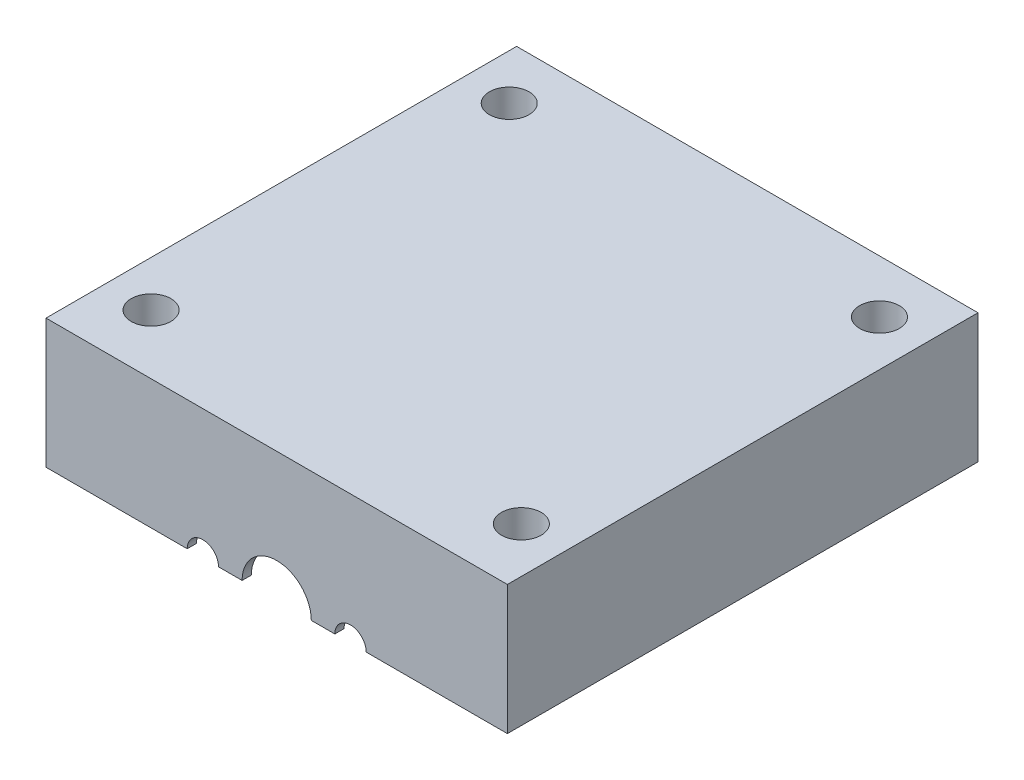
ISO-10303-21;
HEADER;
FILE_DESCRIPTION(('STEP AP214'),'2;1');
FILE_NAME('part.step','',(''),(''),'','','');
FILE_SCHEMA(('AUTOMOTIVE_DESIGN { 1 0 10303 214 1 1 1 1 }'));
ENDSEC;
DATA;
#1=APPLICATION_CONTEXT('core data for automotive mechanical design processes');
#2=APPLICATION_PROTOCOL_DEFINITION('international standard','automotive_design',2000,#1);
#3=PRODUCT_CONTEXT('',#1,'mechanical');
#4=PRODUCT('Part','Part','',(#3));
#5=PRODUCT_RELATED_PRODUCT_CATEGORY('part','',(#4));
#6=PRODUCT_DEFINITION_FORMATION('','',#4);
#7=PRODUCT_DEFINITION_CONTEXT('part definition',#1,'design');
#8=PRODUCT_DEFINITION('design','',#6,#7);
#9=PRODUCT_DEFINITION_SHAPE('','',#8);
#10=(LENGTH_UNIT() NAMED_UNIT(*) SI_UNIT(.MILLI.,.METRE.));
#11=(NAMED_UNIT(*) PLANE_ANGLE_UNIT() SI_UNIT($,.RADIAN.));
#12=(NAMED_UNIT(*) SI_UNIT($,.STERADIAN.) SOLID_ANGLE_UNIT());
#13=UNCERTAINTY_MEASURE_WITH_UNIT(LENGTH_MEASURE(1.E-05),#10,'distance_accuracy_value','');
#14=(GEOMETRIC_REPRESENTATION_CONTEXT(3) GLOBAL_UNCERTAINTY_ASSIGNED_CONTEXT((#13)) GLOBAL_UNIT_ASSIGNED_CONTEXT((#10,
#11,#12)) REPRESENTATION_CONTEXT('',''));
#15=CARTESIAN_POINT('',(0.,0.,0.));
#16=DIRECTION('',(0.,0.,1.));
#17=DIRECTION('',(1.,0.,0.));
#18=AXIS2_PLACEMENT_3D('',#15,#16,#17);
#19=CARTESIAN_POINT('',(0.,0.,0.));
#20=DIRECTION('',(0.,1.,0.));
#21=DIRECTION('',(0.,0.,1.));
#22=AXIS2_PLACEMENT_3D('',#19,#20,#21);
#23=PLANE('',#22);
#24=DIRECTION('',(0.,0.,-1.));
#25=VECTOR('',#24,1.);
#26=CARTESIAN_POINT('',(3.75,0.,51.));
#27=LINE('',#26,#25);
#28=CARTESIAN_POINT('',(3.75,0.,51.));
#29=VERTEX_POINT('',#28);
#30=CARTESIAN_POINT('',(3.75,0.,50.));
#31=VERTEX_POINT('',#30);
#32=EDGE_CURVE('E191',#29,#31,#27,.T.);
#33=ORIENTED_EDGE('',*,*,#32,.T.);
#34=DIRECTION('',(-1.,0.,0.));
#35=VECTOR('',#34,1.);
#36=CARTESIAN_POINT('',(0.,0.,50.));
#37=LINE('',#36,#35);
#38=CARTESIAN_POINT('',(6.30000000000001,0.,50.));
#39=VERTEX_POINT('',#38);
#40=EDGE_CURVE('E197',#39,#31,#37,.T.);
#41=ORIENTED_EDGE('',*,*,#40,.F.);
#42=DIRECTION('',(0.,0.,1.));
#43=VECTOR('',#42,1.);
#44=CARTESIAN_POINT('',(6.30000000000001,0.,51.));
#45=LINE('',#44,#43);
#46=CARTESIAN_POINT('',(6.3,0.,51.));
#47=VERTEX_POINT('',#46);
#48=EDGE_CURVE('E208',#47,#39,#45,.F.);
#49=ORIENTED_EDGE('',*,*,#48,.F.);
#50=DIRECTION('',(-1.,0.,0.));
#51=VECTOR('',#50,1.);
#52=CARTESIAN_POINT('',(0.,0.,51.));
#53=LINE('',#52,#51);
#54=EDGE_CURVE('E343',#47,#29,#53,.T.);
#55=ORIENTED_EDGE('',*,*,#54,.T.);
#56=EDGE_LOOP('',(#33,#41,#49,#55));
#57=FACE_BOUND('',#56,.T.);
#58=ADVANCED_FACE('F41',(#57),#23,.F.);
#59=CARTESIAN_POINT('',(20.0634652174544,0.,5.73907339124369));
#60=DIRECTION('',(0.,1.,0.));
#61=DIRECTION('',(0.,0.,1.));
#62=AXIS2_PLACEMENT_3D('',#59,#60,#61);
#63=CIRCLE('',#62,2.15);
#64=CARTESIAN_POINT('',(20.0634652174544,0.,7.88907339124369));
#65=VERTEX_POINT('',#64);
#66=EDGE_CURVE('E196',#65,#65,#63,.F.);
#67=ORIENTED_EDGE('',*,*,#66,.F.);
#68=EDGE_LOOP('',(#67));
#69=FACE_BOUND('',#68,.T.);
#70=DIRECTION('',(0.,0.,-1.));
#71=VECTOR('',#70,1.);
#72=CARTESIAN_POINT('',(25.,0.,50.));
#73=LINE('',#72,#71);
#74=CARTESIAN_POINT('',(25.,0.,51.));
#75=VERTEX_POINT('',#74);
#76=CARTESIAN_POINT('',(25.,0.,0.));
#77=VERTEX_POINT('',#76);
#78=EDGE_CURVE('E139',#75,#77,#73,.T.);
#79=ORIENTED_EDGE('',*,*,#78,.F.);
#80=CARTESIAN_POINT('',(9.7,0.,51.));
#81=VERTEX_POINT('',#80);
#82=EDGE_CURVE('E193',#75,#81,#53,.T.);
#83=ORIENTED_EDGE('',*,*,#82,.T.);
#84=DIRECTION('',(0.,0.,1.));
#85=VECTOR('',#84,1.);
#86=CARTESIAN_POINT('',(9.69999999999999,0.,51.));
#87=LINE('',#86,#85);
#88=CARTESIAN_POINT('',(9.69999999999999,0.,50.));
#89=VERTEX_POINT('',#88);
#90=EDGE_CURVE('E188',#89,#81,#87,.T.);
#91=ORIENTED_EDGE('',*,*,#90,.F.);
#92=CARTESIAN_POINT('',(12.5,0.,50.));
#93=VERTEX_POINT('',#92);
#94=EDGE_CURVE('E194',#93,#89,#37,.T.);
#95=ORIENTED_EDGE('',*,*,#94,.F.);
#96=DIRECTION('',(0.,0.,-1.));
#97=VECTOR('',#96,1.);
#98=CARTESIAN_POINT('',(12.5,0.,50.));
#99=LINE('',#98,#97);
#100=CARTESIAN_POINT('',(12.5,0.,0.));
#101=VERTEX_POINT('',#100);
#102=EDGE_CURVE('E204',#93,#101,#99,.T.);
#103=ORIENTED_EDGE('',*,*,#102,.T.);
#104=DIRECTION('',(-1.,0.,0.));
#105=VECTOR('',#104,1.);
#106=CARTESIAN_POINT('',(0.,0.,0.));
#107=LINE('',#106,#105);
#108=EDGE_CURVE('E205',#77,#101,#107,.T.);
#109=ORIENTED_EDGE('',*,*,#108,.F.);
#110=EDGE_LOOP('',(#79,#83,#91,#95,#103,#109));
#111=FACE_BOUND('',#110,.T.);
#112=CARTESIAN_POINT('',(20.0634652174544,0.,44.5527588301009));
#113=DIRECTION('',(0.,1.,0.));
#114=DIRECTION('',(0.,0.,1.));
#115=AXIS2_PLACEMENT_3D('',#112,#113,#114);
#116=CIRCLE('',#115,2.15);
#117=CARTESIAN_POINT('',(20.0634652174544,0.,46.7027588301009));
#118=VERTEX_POINT('',#117);
#119=EDGE_CURVE('E45',#118,#118,#116,.F.);
#120=ORIENTED_EDGE('',*,*,#119,.F.);
#121=EDGE_LOOP('',(#120));
#122=FACE_BOUND('',#121,.T.);
#123=ADVANCED_FACE('F228',(#69,#111,#122),#23,.F.);
#124=CARTESIAN_POINT('',(-20.0634652174544,0.,5.73907339124369));
#125=DIRECTION('',(0.,1.,0.));
#126=DIRECTION('',(0.,0.,1.));
#127=AXIS2_PLACEMENT_3D('',#124,#125,#126);
#128=CIRCLE('',#127,2.15);
#129=CARTESIAN_POINT('',(-20.0634652174544,0.,7.88907339124369));
#130=VERTEX_POINT('',#129);
#131=EDGE_CURVE('E216',#130,#130,#128,.F.);
#132=ORIENTED_EDGE('',*,*,#131,.F.);
#133=EDGE_LOOP('',(#132));
#134=FACE_BOUND('',#133,.T.);
#135=DIRECTION('',(0.,0.,-1.));
#136=VECTOR('',#135,1.);
#137=CARTESIAN_POINT('',(-12.5,0.,50.));
#138=LINE('',#137,#136);
#139=CARTESIAN_POINT('',(-12.5,0.,0.));
#140=VERTEX_POINT('',#139);
#141=CARTESIAN_POINT('',(-12.5,0.,50.));
#142=VERTEX_POINT('',#141);
#143=EDGE_CURVE('E201',#140,#142,#138,.F.);
#144=ORIENTED_EDGE('',*,*,#143,.T.);
#145=CARTESIAN_POINT('',(-9.69999999999999,0.,50.));
#146=VERTEX_POINT('',#145);
#147=EDGE_CURVE('E198',#146,#142,#37,.T.);
#148=ORIENTED_EDGE('',*,*,#147,.F.);
#149=DIRECTION('',(0.,0.,1.));
#150=VECTOR('',#149,1.);
#151=CARTESIAN_POINT('',(-9.69999999999999,0.,51.));
#152=LINE('',#151,#150);
#153=CARTESIAN_POINT('',(-9.7,0.,51.));
#154=VERTEX_POINT('',#153);
#155=EDGE_CURVE('E186',#154,#146,#152,.F.);
#156=ORIENTED_EDGE('',*,*,#155,.F.);
#157=CARTESIAN_POINT('',(-25.,0.,51.));
#158=VERTEX_POINT('',#157);
#159=EDGE_CURVE('E189',#154,#158,#53,.T.);
#160=ORIENTED_EDGE('',*,*,#159,.T.);
#161=DIRECTION('',(0.,0.,-1.));
#162=VECTOR('',#161,1.);
#163=CARTESIAN_POINT('',(-25.,0.,50.));
#164=LINE('',#163,#162);
#165=CARTESIAN_POINT('',(-25.,0.,0.));
#166=VERTEX_POINT('',#165);
#167=EDGE_CURVE('E11',#158,#166,#164,.T.);
#168=ORIENTED_EDGE('',*,*,#167,.T.);
#169=EDGE_CURVE('E64',#140,#166,#107,.T.);
#170=ORIENTED_EDGE('',*,*,#169,.F.);
#171=EDGE_LOOP('',(#144,#148,#156,#160,#168,#170));
#172=FACE_BOUND('',#171,.T.);
#173=CARTESIAN_POINT('',(-20.0634652174544,0.,44.5527588301009));
#174=DIRECTION('',(0.,1.,0.));
#175=DIRECTION('',(0.,0.,1.));
#176=AXIS2_PLACEMENT_3D('',#173,#174,#175);
#177=CIRCLE('',#176,2.15);
#178=CARTESIAN_POINT('',(-20.0634652174544,0.,46.7027588301009));
#179=VERTEX_POINT('',#178);
#180=EDGE_CURVE('E218',#179,#179,#177,.F.);
#181=ORIENTED_EDGE('',*,*,#180,.F.);
#182=EDGE_LOOP('',(#181));
#183=FACE_BOUND('',#182,.T.);
#184=ADVANCED_FACE('F230',(#134,#172,#183),#23,.F.);
#185=DIRECTION('',(0.,0.,-1.));
#186=VECTOR('',#185,1.);
#187=CARTESIAN_POINT('',(-3.75,0.,51.));
#188=LINE('',#187,#186);
#189=CARTESIAN_POINT('',(-3.75,0.,50.));
#190=VERTEX_POINT('',#189);
#191=CARTESIAN_POINT('',(-3.75,0.,51.));
#192=VERTEX_POINT('',#191);
#193=EDGE_CURVE('E50',#190,#192,#188,.F.);
#194=ORIENTED_EDGE('',*,*,#193,.T.);
#195=CARTESIAN_POINT('',(-6.3,0.,51.));
#196=VERTEX_POINT('',#195);
#197=EDGE_CURVE('E192',#192,#196,#53,.T.);
#198=ORIENTED_EDGE('',*,*,#197,.T.);
#199=DIRECTION('',(0.,0.,1.));
#200=VECTOR('',#199,1.);
#201=CARTESIAN_POINT('',(-6.30000000000001,0.,51.));
#202=LINE('',#201,#200);
#203=CARTESIAN_POINT('',(-6.30000000000001,0.,50.));
#204=VERTEX_POINT('',#203);
#205=EDGE_CURVE('E138',#204,#196,#202,.T.);
#206=ORIENTED_EDGE('',*,*,#205,.F.);
#207=EDGE_CURVE('E328',#190,#204,#37,.T.);
#208=ORIENTED_EDGE('',*,*,#207,.F.);
#209=EDGE_LOOP('',(#194,#198,#206,#208));
#210=FACE_BOUND('',#209,.T.);
#211=ADVANCED_FACE('F43',(#210),#23,.F.);
#212=CARTESIAN_POINT('',(0.,0.,50.));
#213=DIRECTION('',(0.,0.,-1.));
#214=DIRECTION('',(-1.,0.,0.));
#215=AXIS2_PLACEMENT_3D('',#212,#213,#214);
#216=CYLINDRICAL_SURFACE('',#215,12.5);
#217=ORIENTED_EDGE('',*,*,#102,.F.);
#218=CARTESIAN_POINT('',(0.,0.,50.));
#219=DIRECTION('',(0.,0.,1.));
#220=DIRECTION('',(1.,0.,0.));
#221=AXIS2_PLACEMENT_3D('',#218,#219,#220);
#222=CIRCLE('',#221,12.5);
#223=EDGE_CURVE('E158',#93,#142,#222,.T.);
#224=ORIENTED_EDGE('',*,*,#223,.T.);
#225=ORIENTED_EDGE('',*,*,#143,.F.);
#226=CARTESIAN_POINT('',(0.,0.,0.));
#227=DIRECTION('',(0.,0.,1.));
#228=DIRECTION('',(1.,0.,0.));
#229=AXIS2_PLACEMENT_3D('',#226,#227,#228);
#230=CIRCLE('',#229,12.5);
#231=EDGE_CURVE('E179',#101,#140,#230,.T.);
#232=ORIENTED_EDGE('',*,*,#231,.F.);
#233=EDGE_LOOP('',(#217,#224,#225,#232));
#234=FACE_BOUND('',#233,.T.);
#235=ADVANCED_FACE('F241',(#234),#216,.F.);
#236=CARTESIAN_POINT('',(-25.,0.,50.));
#237=DIRECTION('',(-1.,0.,0.));
#238=DIRECTION('',(0.,-1.,0.));
#239=AXIS2_PLACEMENT_3D('',#236,#237,#238);
#240=PLANE('',#239);
#241=DIRECTION('',(0.,1.,0.));
#242=VECTOR('',#241,1.);
#243=CARTESIAN_POINT('',(-25.,0.,0.));
#244=LINE('',#243,#242);
#245=CARTESIAN_POINT('',(-25.,14.,0.));
#246=VERTEX_POINT('',#245);
#247=EDGE_CURVE('E174',#166,#246,#244,.T.);
#248=ORIENTED_EDGE('',*,*,#247,.F.);
#249=ORIENTED_EDGE('',*,*,#167,.F.);
#250=DIRECTION('',(0.,-1.,0.));
#251=VECTOR('',#250,1.);
#252=CARTESIAN_POINT('',(-25.,14.,51.));
#253=LINE('',#252,#251);
#254=CARTESIAN_POINT('',(-25.,14.,51.));
#255=VERTEX_POINT('',#254);
#256=EDGE_CURVE('E142',#255,#158,#253,.T.);
#257=ORIENTED_EDGE('',*,*,#256,.F.);
#258=DIRECTION('',(0.,0.,-1.));
#259=VECTOR('',#258,1.);
#260=CARTESIAN_POINT('',(-25.,14.,50.));
#261=LINE('',#260,#259);
#262=EDGE_CURVE('E132',#255,#246,#261,.T.);
#263=ORIENTED_EDGE('',*,*,#262,.T.);
#264=EDGE_LOOP('',(#248,#249,#257,#263));
#265=FACE_BOUND('',#264,.T.);
#266=ADVANCED_FACE('F143',(#265),#240,.T.);
#267=CARTESIAN_POINT('',(0.,14.,50.));
#268=DIRECTION('',(0.,1.,0.));
#269=DIRECTION('',(0.,0.,1.));
#270=AXIS2_PLACEMENT_3D('',#267,#268,#269);
#271=PLANE('',#270);
#272=CARTESIAN_POINT('',(20.0634652174544,14.,5.73907339124369));
#273=DIRECTION('',(0.,-1.,0.));
#274=DIRECTION('',(0.,0.,-1.));
#275=AXIS2_PLACEMENT_3D('',#272,#273,#274);
#276=CIRCLE('',#275,2.15);
#277=CARTESIAN_POINT('',(20.0634652174544,14.,3.58907339124369));
#278=VERTEX_POINT('',#277);
#279=EDGE_CURVE('E159',#278,#278,#276,.T.);
#280=ORIENTED_EDGE('',*,*,#279,.T.);
#281=EDGE_LOOP('',(#280));
#282=FACE_BOUND('',#281,.T.);
#283=CARTESIAN_POINT('',(-20.0634652174544,14.,5.73907339124369));
#284=DIRECTION('',(0.,-1.,0.));
#285=DIRECTION('',(0.,0.,-1.));
#286=AXIS2_PLACEMENT_3D('',#283,#284,#285);
#287=CIRCLE('',#286,2.15);
#288=CARTESIAN_POINT('',(-20.0634652174544,14.,3.58907339124369));
#289=VERTEX_POINT('',#288);
#290=EDGE_CURVE('E162',#289,#289,#287,.T.);
#291=ORIENTED_EDGE('',*,*,#290,.T.);
#292=EDGE_LOOP('',(#291));
#293=FACE_BOUND('',#292,.T.);
#294=CARTESIAN_POINT('',(-20.0634652174544,14.,44.5527588301009));
#295=DIRECTION('',(0.,-1.,0.));
#296=DIRECTION('',(0.,0.,-1.));
#297=AXIS2_PLACEMENT_3D('',#294,#295,#296);
#298=CIRCLE('',#297,2.15);
#299=CARTESIAN_POINT('',(-20.0634652174544,14.,42.4027588301009));
#300=VERTEX_POINT('',#299);
#301=EDGE_CURVE('E165',#300,#300,#298,.T.);
#302=ORIENTED_EDGE('',*,*,#301,.T.);
#303=EDGE_LOOP('',(#302));
#304=FACE_BOUND('',#303,.T.);
#305=CARTESIAN_POINT('',(20.0634652174544,14.,44.5527588301009));
#306=DIRECTION('',(0.,-1.,0.));
#307=DIRECTION('',(0.,0.,-1.));
#308=AXIS2_PLACEMENT_3D('',#305,#306,#307);
#309=CIRCLE('',#308,2.15);
#310=CARTESIAN_POINT('',(20.0634652174544,14.,42.4027588301009));
#311=VERTEX_POINT('',#310);
#312=EDGE_CURVE('E168',#311,#311,#309,.T.);
#313=ORIENTED_EDGE('',*,*,#312,.T.);
#314=EDGE_LOOP('',(#313));
#315=FACE_BOUND('',#314,.T.);
#316=DIRECTION('',(1.,0.,0.));
#317=VECTOR('',#316,1.);
#318=CARTESIAN_POINT('',(0.,14.,0.));
#319=LINE('',#318,#317);
#320=CARTESIAN_POINT('',(25.,14.,0.));
#321=VERTEX_POINT('',#320);
#322=EDGE_CURVE('E137',#246,#321,#319,.T.);
#323=ORIENTED_EDGE('',*,*,#322,.F.);
#324=ORIENTED_EDGE('',*,*,#262,.F.);
#325=DIRECTION('',(-1.,0.,0.));
#326=VECTOR('',#325,1.);
#327=CARTESIAN_POINT('',(25.,14.,51.));
#328=LINE('',#327,#326);
#329=CARTESIAN_POINT('',(25.,14.,51.));
#330=VERTEX_POINT('',#329);
#331=EDGE_CURVE('E135',#330,#255,#328,.T.);
#332=ORIENTED_EDGE('',*,*,#331,.F.);
#333=DIRECTION('',(0.,0.,-1.));
#334=VECTOR('',#333,1.);
#335=CARTESIAN_POINT('',(25.,14.,50.));
#336=LINE('',#335,#334);
#337=EDGE_CURVE('E181',#330,#321,#336,.T.);
#338=ORIENTED_EDGE('',*,*,#337,.T.);
#339=EDGE_LOOP('',(#323,#324,#332,#338));
#340=FACE_BOUND('',#339,.T.);
#341=ADVANCED_FACE('F133',(#282,#293,#304,#315,#340),#271,.T.);
#342=CARTESIAN_POINT('',(25.,0.,50.));
#343=DIRECTION('',(1.,0.,0.));
#344=DIRECTION('',(0.,0.,-1.));
#345=AXIS2_PLACEMENT_3D('',#342,#343,#344);
#346=PLANE('',#345);
#347=DIRECTION('',(0.,-1.,0.));
#348=VECTOR('',#347,1.);
#349=CARTESIAN_POINT('',(25.,0.,0.));
#350=LINE('',#349,#348);
#351=EDGE_CURVE('E176',#321,#77,#350,.T.);
#352=ORIENTED_EDGE('',*,*,#351,.F.);
#353=ORIENTED_EDGE('',*,*,#337,.F.);
#354=DIRECTION('',(0.,1.,0.));
#355=VECTOR('',#354,1.);
#356=CARTESIAN_POINT('',(25.,0.,51.));
#357=LINE('',#356,#355);
#358=EDGE_CURVE('E145',#75,#330,#357,.T.);
#359=ORIENTED_EDGE('',*,*,#358,.F.);
#360=ORIENTED_EDGE('',*,*,#78,.T.);
#361=EDGE_LOOP('',(#352,#353,#359,#360));
#362=FACE_BOUND('',#361,.T.);
#363=ADVANCED_FACE('F258',(#362),#346,.T.);
#364=CARTESIAN_POINT('',(0.,0.,50.));
#365=DIRECTION('',(0.,0.,1.));
#366=DIRECTION('',(1.,0.,0.));
#367=AXIS2_PLACEMENT_3D('',#364,#365,#366);
#368=PLANE('',#367);
#369=ORIENTED_EDGE('',*,*,#223,.F.);
#370=ORIENTED_EDGE('',*,*,#94,.T.);
#371=CARTESIAN_POINT('',(8.,0.,50.));
#372=DIRECTION('',(0.,0.,1.));
#373=DIRECTION('',(1.,0.,0.));
#374=AXIS2_PLACEMENT_3D('',#371,#372,#373);
#375=CIRCLE('',#374,1.69999999999999);
#376=EDGE_CURVE('E322',#89,#39,#375,.T.);
#377=ORIENTED_EDGE('',*,*,#376,.T.);
#378=ORIENTED_EDGE('',*,*,#40,.T.);
#379=CARTESIAN_POINT('',(0.,0.,50.));
#380=DIRECTION('',(0.,0.,1.));
#381=DIRECTION('',(1.,0.,0.));
#382=AXIS2_PLACEMENT_3D('',#379,#380,#381);
#383=CIRCLE('',#382,3.75);
#384=EDGE_CURVE('E153',#31,#190,#383,.T.);
#385=ORIENTED_EDGE('',*,*,#384,.T.);
#386=ORIENTED_EDGE('',*,*,#207,.T.);
#387=CARTESIAN_POINT('',(-8.,0.,50.));
#388=DIRECTION('',(0.,0.,1.));
#389=DIRECTION('',(1.,0.,0.));
#390=AXIS2_PLACEMENT_3D('',#387,#388,#389);
#391=CIRCLE('',#390,1.69999999999999);
#392=EDGE_CURVE('E314',#204,#146,#391,.T.);
#393=ORIENTED_EDGE('',*,*,#392,.T.);
#394=ORIENTED_EDGE('',*,*,#147,.T.);
#395=EDGE_LOOP('',(#369,#370,#377,#378,#385,#386,#393,#394));
#396=FACE_BOUND('',#395,.T.);
#397=ADVANCED_FACE('F261',(#396),#368,.F.);
#398=CARTESIAN_POINT('',(0.,0.,51.));
#399=DIRECTION('',(0.,0.,1.));
#400=DIRECTION('',(1.,0.,0.));
#401=AXIS2_PLACEMENT_3D('',#398,#399,#400);
#402=PLANE('',#401);
#403=ORIENTED_EDGE('',*,*,#82,.F.);
#404=ORIENTED_EDGE('',*,*,#358,.T.);
#405=ORIENTED_EDGE('',*,*,#331,.T.);
#406=ORIENTED_EDGE('',*,*,#256,.T.);
#407=ORIENTED_EDGE('',*,*,#159,.F.);
#408=CARTESIAN_POINT('',(-8.,0.,51.));
#409=DIRECTION('',(0.,0.,1.));
#410=DIRECTION('',(1.,0.,0.));
#411=AXIS2_PLACEMENT_3D('',#408,#409,#410);
#412=CIRCLE('',#411,1.7);
#413=EDGE_CURVE('E308',#196,#154,#412,.T.);
#414=ORIENTED_EDGE('',*,*,#413,.F.);
#415=ORIENTED_EDGE('',*,*,#197,.F.);
#416=CARTESIAN_POINT('',(0.,0.,51.));
#417=DIRECTION('',(0.,0.,1.));
#418=DIRECTION('',(1.,0.,0.));
#419=AXIS2_PLACEMENT_3D('',#416,#417,#418);
#420=CIRCLE('',#419,3.75);
#421=EDGE_CURVE('E150',#29,#192,#420,.T.);
#422=ORIENTED_EDGE('',*,*,#421,.F.);
#423=ORIENTED_EDGE('',*,*,#54,.F.);
#424=CARTESIAN_POINT('',(8.,0.,51.));
#425=DIRECTION('',(0.,0.,1.));
#426=DIRECTION('',(1.,0.,0.));
#427=AXIS2_PLACEMENT_3D('',#424,#425,#426);
#428=CIRCLE('',#427,1.7);
#429=EDGE_CURVE('E317',#81,#47,#428,.T.);
#430=ORIENTED_EDGE('',*,*,#429,.F.);
#431=EDGE_LOOP('',(#403,#404,#405,#406,#407,#414,#415,#422,#423,#430));
#432=FACE_BOUND('',#431,.T.);
#433=ADVANCED_FACE('F148',(#432),#402,.T.);
#434=CARTESIAN_POINT('',(-8.,0.,51.));
#435=DIRECTION('',(0.,0.,1.));
#436=DIRECTION('',(1.,0.,0.));
#437=AXIS2_PLACEMENT_3D('',#434,#435,#436);
#438=CYLINDRICAL_SURFACE('',#437,1.69999999999999);
#439=ORIENTED_EDGE('',*,*,#413,.T.);
#440=ORIENTED_EDGE('',*,*,#155,.T.);
#441=ORIENTED_EDGE('',*,*,#392,.F.);
#442=ORIENTED_EDGE('',*,*,#205,.T.);
#443=EDGE_LOOP('',(#439,#440,#441,#442));
#444=FACE_BOUND('',#443,.T.);
#445=ADVANCED_FACE('F294',(#444),#438,.F.);
#446=CARTESIAN_POINT('',(8.,0.,51.));
#447=DIRECTION('',(0.,0.,1.));
#448=DIRECTION('',(1.,0.,0.));
#449=AXIS2_PLACEMENT_3D('',#446,#447,#448);
#450=CYLINDRICAL_SURFACE('',#449,1.69999999999999);
#451=ORIENTED_EDGE('',*,*,#429,.T.);
#452=ORIENTED_EDGE('',*,*,#48,.T.);
#453=ORIENTED_EDGE('',*,*,#376,.F.);
#454=ORIENTED_EDGE('',*,*,#90,.T.);
#455=EDGE_LOOP('',(#451,#452,#453,#454));
#456=FACE_BOUND('',#455,.T.);
#457=ADVANCED_FACE('F297',(#456),#450,.F.);
#458=CARTESIAN_POINT('',(0.,0.,51.));
#459=DIRECTION('',(0.,0.,-1.));
#460=DIRECTION('',(-1.,0.,0.));
#461=AXIS2_PLACEMENT_3D('',#458,#459,#460);
#462=CYLINDRICAL_SURFACE('',#461,3.75);
#463=ORIENTED_EDGE('',*,*,#32,.F.);
#464=ORIENTED_EDGE('',*,*,#421,.T.);
#465=ORIENTED_EDGE('',*,*,#193,.F.);
#466=ORIENTED_EDGE('',*,*,#384,.F.);
#467=EDGE_LOOP('',(#463,#464,#465,#466));
#468=FACE_BOUND('',#467,.T.);
#469=ADVANCED_FACE('F287',(#468),#462,.F.);
#470=CARTESIAN_POINT('',(20.0634652174544,-14.,5.73907339124369));
#471=DIRECTION('',(0.,-1.,0.));
#472=DIRECTION('',(0.,0.,-1.));
#473=AXIS2_PLACEMENT_3D('',#470,#471,#472);
#474=CYLINDRICAL_SURFACE('',#473,2.15);
#475=ORIENTED_EDGE('',*,*,#66,.T.);
#476=EDGE_LOOP('',(#475));
#477=FACE_BOUND('',#476,.T.);
#478=ORIENTED_EDGE('',*,*,#279,.F.);
#479=EDGE_LOOP('',(#478));
#480=FACE_BOUND('',#479,.T.);
#481=ADVANCED_FACE('F281',(#477,#480),#474,.F.);
#482=CARTESIAN_POINT('',(-20.0634652174544,-14.,5.73907339124369));
#483=DIRECTION('',(0.,-1.,0.));
#484=DIRECTION('',(0.,0.,-1.));
#485=AXIS2_PLACEMENT_3D('',#482,#483,#484);
#486=CYLINDRICAL_SURFACE('',#485,2.15);
#487=ORIENTED_EDGE('',*,*,#131,.T.);
#488=EDGE_LOOP('',(#487));
#489=FACE_BOUND('',#488,.T.);
#490=ORIENTED_EDGE('',*,*,#290,.F.);
#491=EDGE_LOOP('',(#490));
#492=FACE_BOUND('',#491,.T.);
#493=ADVANCED_FACE('F277',(#489,#492),#486,.F.);
#494=CARTESIAN_POINT('',(-20.0634652174544,-14.,44.5527588301009));
#495=DIRECTION('',(0.,-1.,0.));
#496=DIRECTION('',(0.,0.,-1.));
#497=AXIS2_PLACEMENT_3D('',#494,#495,#496);
#498=CYLINDRICAL_SURFACE('',#497,2.15);
#499=ORIENTED_EDGE('',*,*,#180,.T.);
#500=EDGE_LOOP('',(#499));
#501=FACE_BOUND('',#500,.T.);
#502=ORIENTED_EDGE('',*,*,#301,.F.);
#503=EDGE_LOOP('',(#502));
#504=FACE_BOUND('',#503,.T.);
#505=ADVANCED_FACE('F254',(#501,#504),#498,.F.);
#506=CARTESIAN_POINT('',(20.0634652174544,-14.,44.5527588301009));
#507=DIRECTION('',(0.,-1.,0.));
#508=DIRECTION('',(0.,0.,-1.));
#509=AXIS2_PLACEMENT_3D('',#506,#507,#508);
#510=CYLINDRICAL_SURFACE('',#509,2.15);
#511=ORIENTED_EDGE('',*,*,#119,.T.);
#512=EDGE_LOOP('',(#511));
#513=FACE_BOUND('',#512,.T.);
#514=ORIENTED_EDGE('',*,*,#312,.F.);
#515=EDGE_LOOP('',(#514));
#516=FACE_BOUND('',#515,.T.);
#517=ADVANCED_FACE('F225',(#513,#516),#510,.F.);
#518=CARTESIAN_POINT('',(0.,0.,0.));
#519=DIRECTION('',(0.,0.,1.));
#520=DIRECTION('',(1.,0.,0.));
#521=AXIS2_PLACEMENT_3D('',#518,#519,#520);
#522=PLANE('',#521);
#523=ORIENTED_EDGE('',*,*,#351,.T.);
#524=ORIENTED_EDGE('',*,*,#108,.T.);
#525=ORIENTED_EDGE('',*,*,#231,.T.);
#526=ORIENTED_EDGE('',*,*,#169,.T.);
#527=ORIENTED_EDGE('',*,*,#247,.T.);
#528=ORIENTED_EDGE('',*,*,#322,.T.);
#529=EDGE_LOOP('',(#523,#524,#525,#526,#527,#528));
#530=FACE_BOUND('',#529,.T.);
#531=ADVANCED_FACE('F243',(#530),#522,.F.);
#532=CLOSED_SHELL('',(#58,#123,#184,#211,#235,#266,#341,#363,#397,#433,#445,#457,#469,#481,#493,
#505,#517,#531));
#533=MANIFOLD_SOLID_BREP('B2',#532);
#534=ADVANCED_BREP_SHAPE_REPRESENTATION('',(#18,#533),#14);
#535=SHAPE_DEFINITION_REPRESENTATION(#9,#534);
ENDSEC;
END-ISO-10303-21;
